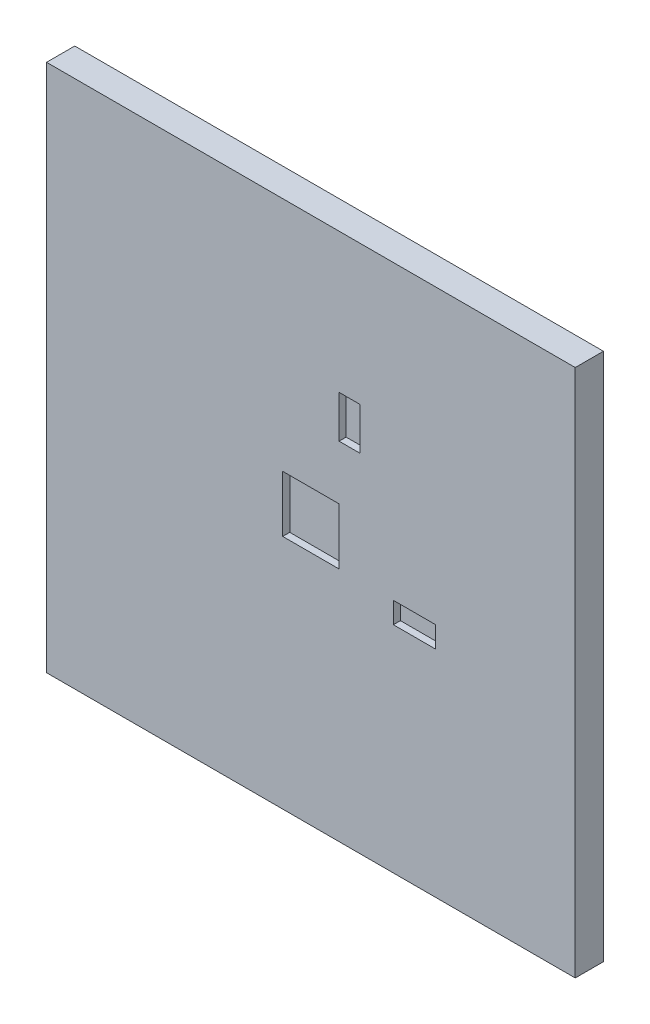
ISO-10303-21;
HEADER;
FILE_DESCRIPTION(('STEP AP214'),'2;1');
FILE_NAME('part.step','',(''),(''),'','','');
FILE_SCHEMA(('AUTOMOTIVE_DESIGN { 1 0 10303 214 1 1 1 1 }'));
ENDSEC;
DATA;
#1=APPLICATION_CONTEXT('core data for automotive mechanical design processes');
#2=APPLICATION_PROTOCOL_DEFINITION('international standard','automotive_design',2000,#1);
#3=PRODUCT_CONTEXT('',#1,'mechanical');
#4=PRODUCT('Part','Part','',(#3));
#5=PRODUCT_RELATED_PRODUCT_CATEGORY('part','',(#4));
#6=PRODUCT_DEFINITION_FORMATION('','',#4);
#7=PRODUCT_DEFINITION_CONTEXT('part definition',#1,'design');
#8=PRODUCT_DEFINITION('design','',#6,#7);
#9=PRODUCT_DEFINITION_SHAPE('','',#8);
#10=(LENGTH_UNIT() NAMED_UNIT(*) SI_UNIT(.MILLI.,.METRE.));
#11=(NAMED_UNIT(*) PLANE_ANGLE_UNIT() SI_UNIT($,.RADIAN.));
#12=(NAMED_UNIT(*) SI_UNIT($,.STERADIAN.) SOLID_ANGLE_UNIT());
#13=UNCERTAINTY_MEASURE_WITH_UNIT(LENGTH_MEASURE(1.E-05),#10,'distance_accuracy_value','');
#14=(GEOMETRIC_REPRESENTATION_CONTEXT(3) GLOBAL_UNCERTAINTY_ASSIGNED_CONTEXT((#13)) GLOBAL_UNIT_ASSIGNED_CONTEXT((#10,
#11,#12)) REPRESENTATION_CONTEXT('',''));
#15=CARTESIAN_POINT('',(0.,0.,0.));
#16=DIRECTION('',(0.,0.,1.));
#17=DIRECTION('',(1.,0.,0.));
#18=AXIS2_PLACEMENT_3D('',#15,#16,#17);
#19=CARTESIAN_POINT('',(0.,0.,20.));
#20=DIRECTION('',(0.,0.,-1.));
#21=DIRECTION('',(-1.,0.,0.));
#22=AXIS2_PLACEMENT_3D('',#19,#20,#21);
#23=PLANE('',#22);
#24=DIRECTION('',(0.,-1.,0.));
#25=VECTOR('',#24,1.);
#26=CARTESIAN_POINT('',(81.3191489361703,0.,20.));
#27=LINE('',#26,#25);
#28=CARTESIAN_POINT('',(81.3191489361703,-115.212765957447,20.));
#29=VERTEX_POINT('',#28);
#30=CARTESIAN_POINT('',(81.3191489361703,-130.212765957447,20.));
#31=VERTEX_POINT('',#30);
#32=EDGE_CURVE('E63',#29,#31,#27,.T.);
#33=ORIENTED_EDGE('',*,*,#32,.T.);
#34=DIRECTION('',(1.,0.,0.));
#35=VECTOR('',#34,1.);
#36=CARTESIAN_POINT('',(0.,-130.212765957447,20.));
#37=LINE('',#36,#35);
#38=CARTESIAN_POINT('',(51.3191489361703,-130.212765957447,20.));
#39=VERTEX_POINT('',#38);
#40=EDGE_CURVE('E218',#39,#31,#37,.T.);
#41=ORIENTED_EDGE('',*,*,#40,.F.);
#42=DIRECTION('',(0.,-1.,0.));
#43=VECTOR('',#42,1.);
#44=CARTESIAN_POINT('',(51.3191489361703,0.,20.));
#45=LINE('',#44,#43);
#46=CARTESIAN_POINT('',(51.3191489361703,-115.212765957447,20.));
#47=VERTEX_POINT('',#46);
#48=EDGE_CURVE('E222',#47,#39,#45,.T.);
#49=ORIENTED_EDGE('',*,*,#48,.F.);
#50=DIRECTION('',(1.,0.,0.));
#51=VECTOR('',#50,1.);
#52=CARTESIAN_POINT('',(0.,-115.212765957447,20.));
#53=LINE('',#52,#51);
#54=EDGE_CURVE('E227',#47,#29,#53,.T.);
#55=ORIENTED_EDGE('',*,*,#54,.T.);
#56=EDGE_LOOP('',(#33,#41,#49,#55));
#57=FACE_BOUND('',#56,.T.);
#58=DIRECTION('',(0.,-1.,0.));
#59=VECTOR('',#58,1.);
#60=CARTESIAN_POINT('',(12.8191489361703,-75.2127659574467,20.));
#61=LINE('',#60,#59);
#62=CARTESIAN_POINT('',(12.8191489361703,-75.2127659574467,20.));
#63=VERTEX_POINT('',#62);
#64=CARTESIAN_POINT('',(12.8191489361703,-115.212765957447,20.));
#65=VERTEX_POINT('',#64);
#66=EDGE_CURVE('E268',#63,#65,#61,.T.);
#67=ORIENTED_EDGE('',*,*,#66,.T.);
#68=DIRECTION('',(1.,0.,0.));
#69=VECTOR('',#68,1.);
#70=CARTESIAN_POINT('',(-27.1808510638297,-115.212765957447,20.));
#71=LINE('',#70,#69);
#72=CARTESIAN_POINT('',(-27.1808510638297,-115.212765957447,20.));
#73=VERTEX_POINT('',#72);
#74=EDGE_CURVE('E217',#73,#65,#71,.T.);
#75=ORIENTED_EDGE('',*,*,#74,.F.);
#76=DIRECTION('',(0.,-1.,0.));
#77=VECTOR('',#76,1.);
#78=CARTESIAN_POINT('',(-27.1808510638297,-75.2127659574467,20.));
#79=LINE('',#78,#77);
#80=CARTESIAN_POINT('',(-27.1808510638297,-75.2127659574467,20.));
#81=VERTEX_POINT('',#80);
#82=EDGE_CURVE('E259',#81,#73,#79,.T.);
#83=ORIENTED_EDGE('',*,*,#82,.F.);
#84=DIRECTION('',(1.,0.,0.));
#85=VECTOR('',#84,1.);
#86=CARTESIAN_POINT('',(-27.1808510638297,-75.2127659574467,20.));
#87=LINE('',#86,#85);
#88=EDGE_CURVE('E263',#81,#63,#87,.T.);
#89=ORIENTED_EDGE('',*,*,#88,.T.);
#90=EDGE_LOOP('',(#67,#75,#83,#89));
#91=FACE_BOUND('',#90,.T.);
#92=DIRECTION('',(1.,0.,0.));
#93=VECTOR('',#92,1.);
#94=CARTESIAN_POINT('',(-194.68085106383,-282.712765957447,20.));
#95=LINE('',#94,#93);
#96=CARTESIAN_POINT('',(-194.68085106383,-282.712765957447,20.));
#97=VERTEX_POINT('',#96);
#98=CARTESIAN_POINT('',(180.31914893617,-282.712765957447,20.));
#99=VERTEX_POINT('',#98);
#100=EDGE_CURVE('E286',#97,#99,#95,.T.);
#101=ORIENTED_EDGE('',*,*,#100,.T.);
#102=DIRECTION('',(0.,-1.,0.));
#103=VECTOR('',#102,1.);
#104=CARTESIAN_POINT('',(180.31914893617,92.2872340425532,20.));
#105=LINE('',#104,#103);
#106=CARTESIAN_POINT('',(180.31914893617,92.2872340425532,20.));
#107=VERTEX_POINT('',#106);
#108=EDGE_CURVE('E289',#107,#99,#105,.T.);
#109=ORIENTED_EDGE('',*,*,#108,.F.);
#110=DIRECTION('',(1.,0.,0.));
#111=VECTOR('',#110,1.);
#112=CARTESIAN_POINT('',(-194.68085106383,92.2872340425532,20.));
#113=LINE('',#112,#111);
#114=CARTESIAN_POINT('',(-194.68085106383,92.2872340425532,20.));
#115=VERTEX_POINT('',#114);
#116=EDGE_CURVE('E294',#115,#107,#113,.T.);
#117=ORIENTED_EDGE('',*,*,#116,.F.);
#118=DIRECTION('',(0.,-1.,0.));
#119=VECTOR('',#118,1.);
#120=CARTESIAN_POINT('',(-194.68085106383,92.2872340425532,20.));
#121=LINE('',#120,#119);
#122=EDGE_CURVE('E298',#115,#97,#121,.T.);
#123=ORIENTED_EDGE('',*,*,#122,.T.);
#124=EDGE_LOOP('',(#101,#109,#117,#123));
#125=FACE_BOUND('',#124,.T.);
#126=DIRECTION('',(0.,-1.,0.));
#127=VECTOR('',#126,1.);
#128=CARTESIAN_POINT('',(27.8191489361703,0.,20.));
#129=LINE('',#128,#127);
#130=CARTESIAN_POINT('',(27.8191489361703,-6.7127659574468,20.));
#131=VERTEX_POINT('',#130);
#132=CARTESIAN_POINT('',(27.8191489361703,-36.7127659574468,20.));
#133=VERTEX_POINT('',#132);
#134=EDGE_CURVE('E55',#131,#133,#129,.T.);
#135=ORIENTED_EDGE('',*,*,#134,.T.);
#136=DIRECTION('',(1.,0.,0.));
#137=VECTOR('',#136,1.);
#138=CARTESIAN_POINT('',(0.,-36.7127659574468,20.));
#139=LINE('',#138,#137);
#140=CARTESIAN_POINT('',(12.8191489361703,-36.7127659574468,20.));
#141=VERTEX_POINT('',#140);
#142=EDGE_CURVE('E176',#141,#133,#139,.T.);
#143=ORIENTED_EDGE('',*,*,#142,.F.);
#144=DIRECTION('',(0.,-1.,0.));
#145=VECTOR('',#144,1.);
#146=CARTESIAN_POINT('',(12.8191489361703,0.,20.));
#147=LINE('',#146,#145);
#148=CARTESIAN_POINT('',(12.8191489361703,-6.7127659574468,20.));
#149=VERTEX_POINT('',#148);
#150=EDGE_CURVE('E180',#149,#141,#147,.T.);
#151=ORIENTED_EDGE('',*,*,#150,.F.);
#152=DIRECTION('',(1.,0.,0.));
#153=VECTOR('',#152,1.);
#154=CARTESIAN_POINT('',(0.,-6.7127659574468,20.));
#155=LINE('',#154,#153);
#156=EDGE_CURVE('E189',#149,#131,#155,.T.);
#157=ORIENTED_EDGE('',*,*,#156,.T.);
#158=EDGE_LOOP('',(#135,#143,#151,#157));
#159=FACE_BOUND('',#158,.T.);
#160=ADVANCED_FACE('F39',(#57,#91,#125,#159),#23,.F.);
#161=CARTESIAN_POINT('',(-194.68085106383,-282.712765957447,20.));
#162=DIRECTION('',(0.,1.,0.));
#163=DIRECTION('',(0.,0.,1.));
#164=AXIS2_PLACEMENT_3D('',#161,#162,#163);
#165=PLANE('',#164);
#166=DIRECTION('',(1.,0.,0.));
#167=VECTOR('',#166,1.);
#168=CARTESIAN_POINT('',(-194.68085106383,-282.712765957447,0.));
#169=LINE('',#168,#167);
#170=CARTESIAN_POINT('',(-194.68085106383,-282.712765957447,0.));
#171=VERTEX_POINT('',#170);
#172=CARTESIAN_POINT('',(180.31914893617,-282.712765957447,0.));
#173=VERTEX_POINT('',#172);
#174=EDGE_CURVE('E198',#171,#173,#169,.T.);
#175=ORIENTED_EDGE('',*,*,#174,.T.);
#176=DIRECTION('',(0.,0.,-1.));
#177=VECTOR('',#176,1.);
#178=CARTESIAN_POINT('',(180.31914893617,-282.712765957447,20.));
#179=LINE('',#178,#177);
#180=EDGE_CURVE('E11',#99,#173,#179,.T.);
#181=ORIENTED_EDGE('',*,*,#180,.F.);
#182=ORIENTED_EDGE('',*,*,#100,.F.);
#183=DIRECTION('',(0.,0.,-1.));
#184=VECTOR('',#183,1.);
#185=CARTESIAN_POINT('',(-194.68085106383,-282.712765957447,20.));
#186=LINE('',#185,#184);
#187=EDGE_CURVE('E301',#97,#171,#186,.T.);
#188=ORIENTED_EDGE('',*,*,#187,.T.);
#189=EDGE_LOOP('',(#175,#181,#182,#188));
#190=FACE_BOUND('',#189,.T.);
#191=ADVANCED_FACE('F41',(#190),#165,.F.);
#192=CARTESIAN_POINT('',(180.31914893617,92.2872340425532,20.));
#193=DIRECTION('',(1.,0.,0.));
#194=DIRECTION('',(0.,1.,0.));
#195=AXIS2_PLACEMENT_3D('',#192,#193,#194);
#196=PLANE('',#195);
#197=DIRECTION('',(0.,-1.,0.));
#198=VECTOR('',#197,1.);
#199=CARTESIAN_POINT('',(180.31914893617,92.2872340425532,0.));
#200=LINE('',#199,#198);
#201=CARTESIAN_POINT('',(180.31914893617,92.2872340425532,0.));
#202=VERTEX_POINT('',#201);
#203=EDGE_CURVE('E305',#202,#173,#200,.T.);
#204=ORIENTED_EDGE('',*,*,#203,.F.);
#205=DIRECTION('',(0.,0.,-1.));
#206=VECTOR('',#205,1.);
#207=CARTESIAN_POINT('',(180.31914893617,92.2872340425532,20.));
#208=LINE('',#207,#206);
#209=EDGE_CURVE('E48',#107,#202,#208,.T.);
#210=ORIENTED_EDGE('',*,*,#209,.F.);
#211=ORIENTED_EDGE('',*,*,#108,.T.);
#212=ORIENTED_EDGE('',*,*,#180,.T.);
#213=EDGE_LOOP('',(#204,#210,#211,#212));
#214=FACE_BOUND('',#213,.T.);
#215=ADVANCED_FACE('F328',(#214),#196,.T.);
#216=CARTESIAN_POINT('',(-194.68085106383,92.2872340425532,20.));
#217=DIRECTION('',(0.,1.,0.));
#218=DIRECTION('',(0.,0.,1.));
#219=AXIS2_PLACEMENT_3D('',#216,#217,#218);
#220=PLANE('',#219);
#221=DIRECTION('',(1.,0.,0.));
#222=VECTOR('',#221,1.);
#223=CARTESIAN_POINT('',(-194.68085106383,92.2872340425532,0.));
#224=LINE('',#223,#222);
#225=CARTESIAN_POINT('',(-194.68085106383,92.2872340425532,0.));
#226=VERTEX_POINT('',#225);
#227=EDGE_CURVE('E309',#226,#202,#224,.T.);
#228=ORIENTED_EDGE('',*,*,#227,.F.);
#229=DIRECTION('',(0.,0.,-1.));
#230=VECTOR('',#229,1.);
#231=CARTESIAN_POINT('',(-194.68085106383,92.2872340425532,20.));
#232=LINE('',#231,#230);
#233=EDGE_CURVE('E318',#115,#226,#232,.T.);
#234=ORIENTED_EDGE('',*,*,#233,.F.);
#235=ORIENTED_EDGE('',*,*,#116,.T.);
#236=ORIENTED_EDGE('',*,*,#209,.T.);
#237=EDGE_LOOP('',(#228,#234,#235,#236));
#238=FACE_BOUND('',#237,.T.);
#239=ADVANCED_FACE('F324',(#238),#220,.T.);
#240=CARTESIAN_POINT('',(-194.68085106383,92.2872340425532,20.));
#241=DIRECTION('',(1.,0.,0.));
#242=DIRECTION('',(0.,1.,0.));
#243=AXIS2_PLACEMENT_3D('',#240,#241,#242);
#244=PLANE('',#243);
#245=DIRECTION('',(0.,-1.,0.));
#246=VECTOR('',#245,1.);
#247=CARTESIAN_POINT('',(-194.68085106383,92.2872340425532,0.));
#248=LINE('',#247,#246);
#249=EDGE_CURVE('E290',#226,#171,#248,.T.);
#250=ORIENTED_EDGE('',*,*,#249,.T.);
#251=ORIENTED_EDGE('',*,*,#187,.F.);
#252=ORIENTED_EDGE('',*,*,#122,.F.);
#253=ORIENTED_EDGE('',*,*,#233,.T.);
#254=EDGE_LOOP('',(#250,#251,#252,#253));
#255=FACE_BOUND('',#254,.T.);
#256=ADVANCED_FACE('F336',(#255),#244,.F.);
#257=CARTESIAN_POINT('',(0.,0.,0.));
#258=DIRECTION('',(0.,0.,-1.));
#259=DIRECTION('',(-1.,0.,0.));
#260=AXIS2_PLACEMENT_3D('',#257,#258,#259);
#261=PLANE('',#260);
#262=ORIENTED_EDGE('',*,*,#174,.F.);
#263=ORIENTED_EDGE('',*,*,#249,.F.);
#264=ORIENTED_EDGE('',*,*,#227,.T.);
#265=ORIENTED_EDGE('',*,*,#203,.T.);
#266=EDGE_LOOP('',(#262,#263,#264,#265));
#267=FACE_BOUND('',#266,.T.);
#268=ADVANCED_FACE('F333',(#267),#261,.T.);
#269=CARTESIAN_POINT('',(-27.1808510638297,-115.212765957447,15.));
#270=DIRECTION('',(0.,-1.,0.));
#271=DIRECTION('',(0.,0.,-1.));
#272=AXIS2_PLACEMENT_3D('',#269,#270,#271);
#273=PLANE('',#272);
#274=ORIENTED_EDGE('',*,*,#74,.T.);
#275=DIRECTION('',(0.,0.,1.));
#276=VECTOR('',#275,1.);
#277=CARTESIAN_POINT('',(12.8191489361703,-115.212765957447,15.));
#278=LINE('',#277,#276);
#279=CARTESIAN_POINT('',(12.8191489361703,-115.212765957447,15.));
#280=VERTEX_POINT('',#279);
#281=EDGE_CURVE('E245',#280,#65,#278,.T.);
#282=ORIENTED_EDGE('',*,*,#281,.F.);
#283=DIRECTION('',(1.,0.,0.));
#284=VECTOR('',#283,1.);
#285=CARTESIAN_POINT('',(-27.1808510638297,-115.212765957447,15.));
#286=LINE('',#285,#284);
#287=CARTESIAN_POINT('',(-27.1808510638297,-115.212765957447,15.));
#288=VERTEX_POINT('',#287);
#289=EDGE_CURVE('E264',#288,#280,#286,.T.);
#290=ORIENTED_EDGE('',*,*,#289,.F.);
#291=DIRECTION('',(0.,0.,1.));
#292=VECTOR('',#291,1.);
#293=CARTESIAN_POINT('',(-27.1808510638297,-115.212765957447,15.));
#294=LINE('',#293,#292);
#295=EDGE_CURVE('E256',#288,#73,#294,.T.);
#296=ORIENTED_EDGE('',*,*,#295,.T.);
#297=EDGE_LOOP('',(#274,#282,#290,#296));
#298=FACE_BOUND('',#297,.T.);
#299=ADVANCED_FACE('F383',(#298),#273,.F.);
#300=CARTESIAN_POINT('',(-27.1808510638297,-75.2127659574467,15.));
#301=DIRECTION('',(-1.,0.,0.));
#302=DIRECTION('',(0.,0.,1.));
#303=AXIS2_PLACEMENT_3D('',#300,#301,#302);
#304=PLANE('',#303);
#305=ORIENTED_EDGE('',*,*,#82,.T.);
#306=ORIENTED_EDGE('',*,*,#295,.F.);
#307=DIRECTION('',(0.,-1.,0.));
#308=VECTOR('',#307,1.);
#309=CARTESIAN_POINT('',(-27.1808510638297,-75.2127659574467,15.));
#310=LINE('',#309,#308);
#311=CARTESIAN_POINT('',(-27.1808510638297,-75.2127659574467,15.));
#312=VERTEX_POINT('',#311);
#313=EDGE_CURVE('E249',#312,#288,#310,.T.);
#314=ORIENTED_EDGE('',*,*,#313,.F.);
#315=DIRECTION('',(0.,0.,1.));
#316=VECTOR('',#315,1.);
#317=CARTESIAN_POINT('',(-27.1808510638297,-75.2127659574467,15.));
#318=LINE('',#317,#316);
#319=EDGE_CURVE('E253',#312,#81,#318,.T.);
#320=ORIENTED_EDGE('',*,*,#319,.T.);
#321=EDGE_LOOP('',(#305,#306,#314,#320));
#322=FACE_BOUND('',#321,.T.);
#323=ADVANCED_FACE('F386',(#322),#304,.F.);
#324=CARTESIAN_POINT('',(-27.1808510638297,-75.2127659574467,15.));
#325=DIRECTION('',(0.,-1.,0.));
#326=DIRECTION('',(0.,0.,-1.));
#327=AXIS2_PLACEMENT_3D('',#324,#325,#326);
#328=PLANE('',#327);
#329=ORIENTED_EDGE('',*,*,#88,.F.);
#330=ORIENTED_EDGE('',*,*,#319,.F.);
#331=DIRECTION('',(1.,0.,0.));
#332=VECTOR('',#331,1.);
#333=CARTESIAN_POINT('',(-27.1808510638297,-75.2127659574467,15.));
#334=LINE('',#333,#332);
#335=CARTESIAN_POINT('',(12.8191489361703,-75.2127659574467,15.));
#336=VERTEX_POINT('',#335);
#337=EDGE_CURVE('E277',#312,#336,#334,.T.);
#338=ORIENTED_EDGE('',*,*,#337,.T.);
#339=DIRECTION('',(0.,0.,1.));
#340=VECTOR('',#339,1.);
#341=CARTESIAN_POINT('',(12.8191489361703,-75.2127659574467,15.));
#342=LINE('',#341,#340);
#343=EDGE_CURVE('E250',#336,#63,#342,.T.);
#344=ORIENTED_EDGE('',*,*,#343,.T.);
#345=EDGE_LOOP('',(#329,#330,#338,#344));
#346=FACE_BOUND('',#345,.T.);
#347=ADVANCED_FACE('F391',(#346),#328,.T.);
#348=CARTESIAN_POINT('',(12.8191489361703,-75.2127659574467,15.));
#349=DIRECTION('',(-1.,0.,0.));
#350=DIRECTION('',(0.,-1.,0.));
#351=AXIS2_PLACEMENT_3D('',#348,#349,#350);
#352=PLANE('',#351);
#353=ORIENTED_EDGE('',*,*,#66,.F.);
#354=ORIENTED_EDGE('',*,*,#343,.F.);
#355=DIRECTION('',(0.,-1.,0.));
#356=VECTOR('',#355,1.);
#357=CARTESIAN_POINT('',(12.8191489361703,-75.2127659574467,15.));
#358=LINE('',#357,#356);
#359=EDGE_CURVE('E280',#336,#280,#358,.T.);
#360=ORIENTED_EDGE('',*,*,#359,.T.);
#361=ORIENTED_EDGE('',*,*,#281,.T.);
#362=EDGE_LOOP('',(#353,#354,#360,#361));
#363=FACE_BOUND('',#362,.T.);
#364=ADVANCED_FACE('F388',(#363),#352,.T.);
#365=CARTESIAN_POINT('',(0.,0.,15.));
#366=DIRECTION('',(0.,0.,-1.));
#367=DIRECTION('',(-1.,0.,0.));
#368=AXIS2_PLACEMENT_3D('',#365,#366,#367);
#369=PLANE('',#368);
#370=ORIENTED_EDGE('',*,*,#289,.T.);
#371=ORIENTED_EDGE('',*,*,#359,.F.);
#372=ORIENTED_EDGE('',*,*,#337,.F.);
#373=ORIENTED_EDGE('',*,*,#313,.T.);
#374=EDGE_LOOP('',(#370,#371,#372,#373));
#375=FACE_BOUND('',#374,.T.);
#376=ADVANCED_FACE('F368',(#375),#369,.F.);
#377=CARTESIAN_POINT('',(81.3191489361703,0.,15.));
#378=DIRECTION('',(-1.,0.,0.));
#379=DIRECTION('',(0.,0.,1.));
#380=AXIS2_PLACEMENT_3D('',#377,#378,#379);
#381=PLANE('',#380);
#382=ORIENTED_EDGE('',*,*,#32,.F.);
#383=DIRECTION('',(0.,0.,1.));
#384=VECTOR('',#383,1.);
#385=CARTESIAN_POINT('',(81.3191489361703,-115.212765957447,15.));
#386=LINE('',#385,#384);
#387=CARTESIAN_POINT('',(81.3191489361703,-115.212765957447,15.));
#388=VERTEX_POINT('',#387);
#389=EDGE_CURVE('E204',#388,#29,#386,.T.);
#390=ORIENTED_EDGE('',*,*,#389,.F.);
#391=DIRECTION('',(0.,-1.,0.));
#392=VECTOR('',#391,1.);
#393=CARTESIAN_POINT('',(81.3191489361703,0.,15.));
#394=LINE('',#393,#392);
#395=CARTESIAN_POINT('',(81.3191489361703,-130.212765957447,15.));
#396=VERTEX_POINT('',#395);
#397=EDGE_CURVE('E223',#388,#396,#394,.T.);
#398=ORIENTED_EDGE('',*,*,#397,.T.);
#399=DIRECTION('',(0.,0.,1.));
#400=VECTOR('',#399,1.);
#401=CARTESIAN_POINT('',(81.3191489361703,-130.212765957447,15.));
#402=LINE('',#401,#400);
#403=EDGE_CURVE('E214',#396,#31,#402,.T.);
#404=ORIENTED_EDGE('',*,*,#403,.T.);
#405=EDGE_LOOP('',(#382,#390,#398,#404));
#406=FACE_BOUND('',#405,.T.);
#407=ADVANCED_FACE('F364',(#406),#381,.T.);
#408=CARTESIAN_POINT('',(0.,-130.212765957447,15.));
#409=DIRECTION('',(0.,-1.,0.));
#410=DIRECTION('',(0.,0.,-1.));
#411=AXIS2_PLACEMENT_3D('',#408,#409,#410);
#412=PLANE('',#411);
#413=ORIENTED_EDGE('',*,*,#40,.T.);
#414=ORIENTED_EDGE('',*,*,#403,.F.);
#415=DIRECTION('',(1.,0.,0.));
#416=VECTOR('',#415,1.);
#417=CARTESIAN_POINT('',(0.,-130.212765957447,15.));
#418=LINE('',#417,#416);
#419=CARTESIAN_POINT('',(51.3191489361703,-130.212765957447,15.));
#420=VERTEX_POINT('',#419);
#421=EDGE_CURVE('E207',#420,#396,#418,.T.);
#422=ORIENTED_EDGE('',*,*,#421,.F.);
#423=DIRECTION('',(0.,0.,1.));
#424=VECTOR('',#423,1.);
#425=CARTESIAN_POINT('',(51.3191489361703,-130.212765957447,15.));
#426=LINE('',#425,#424);
#427=EDGE_CURVE('E211',#420,#39,#426,.T.);
#428=ORIENTED_EDGE('',*,*,#427,.T.);
#429=EDGE_LOOP('',(#413,#414,#422,#428));
#430=FACE_BOUND('',#429,.T.);
#431=ADVANCED_FACE('F367',(#430),#412,.F.);
#432=CARTESIAN_POINT('',(51.3191489361703,0.,15.));
#433=DIRECTION('',(-1.,0.,0.));
#434=DIRECTION('',(0.,0.,1.));
#435=AXIS2_PLACEMENT_3D('',#432,#433,#434);
#436=PLANE('',#435);
#437=ORIENTED_EDGE('',*,*,#48,.T.);
#438=ORIENTED_EDGE('',*,*,#427,.F.);
#439=DIRECTION('',(0.,-1.,0.));
#440=VECTOR('',#439,1.);
#441=CARTESIAN_POINT('',(51.3191489361703,0.,15.));
#442=LINE('',#441,#440);
#443=CARTESIAN_POINT('',(51.3191489361703,-115.212765957447,15.));
#444=VERTEX_POINT('',#443);
#445=EDGE_CURVE('E236',#444,#420,#442,.T.);
#446=ORIENTED_EDGE('',*,*,#445,.F.);
#447=DIRECTION('',(0.,0.,1.));
#448=VECTOR('',#447,1.);
#449=CARTESIAN_POINT('',(51.3191489361703,-115.212765957447,15.));
#450=LINE('',#449,#448);
#451=EDGE_CURVE('E208',#444,#47,#450,.T.);
#452=ORIENTED_EDGE('',*,*,#451,.T.);
#453=EDGE_LOOP('',(#437,#438,#446,#452));
#454=FACE_BOUND('',#453,.T.);
#455=ADVANCED_FACE('F372',(#454),#436,.F.);
#456=CARTESIAN_POINT('',(0.,-115.212765957447,15.));
#457=DIRECTION('',(0.,-1.,0.));
#458=DIRECTION('',(0.,0.,-1.));
#459=AXIS2_PLACEMENT_3D('',#456,#457,#458);
#460=PLANE('',#459);
#461=ORIENTED_EDGE('',*,*,#54,.F.);
#462=ORIENTED_EDGE('',*,*,#451,.F.);
#463=DIRECTION('',(1.,0.,0.));
#464=VECTOR('',#463,1.);
#465=CARTESIAN_POINT('',(0.,-115.212765957447,15.));
#466=LINE('',#465,#464);
#467=EDGE_CURVE('E240',#444,#388,#466,.T.);
#468=ORIENTED_EDGE('',*,*,#467,.T.);
#469=ORIENTED_EDGE('',*,*,#389,.T.);
#470=EDGE_LOOP('',(#461,#462,#468,#469));
#471=FACE_BOUND('',#470,.T.);
#472=ADVANCED_FACE('F369',(#471),#460,.T.);
#473=CARTESIAN_POINT('',(0.,0.,15.));
#474=DIRECTION('',(0.,0.,1.));
#475=DIRECTION('',(1.,0.,0.));
#476=AXIS2_PLACEMENT_3D('',#473,#474,#475);
#477=PLANE('',#476);
#478=ORIENTED_EDGE('',*,*,#397,.F.);
#479=ORIENTED_EDGE('',*,*,#467,.F.);
#480=ORIENTED_EDGE('',*,*,#445,.T.);
#481=ORIENTED_EDGE('',*,*,#421,.T.);
#482=EDGE_LOOP('',(#478,#479,#480,#481));
#483=FACE_BOUND('',#482,.T.);
#484=ADVANCED_FACE('F358',(#483),#477,.T.);
#485=CARTESIAN_POINT('',(27.8191489361703,0.,15.));
#486=DIRECTION('',(-1.,0.,0.));
#487=DIRECTION('',(0.,-1.,0.));
#488=AXIS2_PLACEMENT_3D('',#485,#486,#487);
#489=PLANE('',#488);
#490=ORIENTED_EDGE('',*,*,#134,.F.);
#491=DIRECTION('',(0.,0.,1.));
#492=VECTOR('',#491,1.);
#493=CARTESIAN_POINT('',(27.8191489361703,-6.7127659574468,15.));
#494=LINE('',#493,#492);
#495=CARTESIAN_POINT('',(27.8191489361703,-6.7127659574468,15.));
#496=VERTEX_POINT('',#495);
#497=EDGE_CURVE('E156',#496,#131,#494,.T.);
#498=ORIENTED_EDGE('',*,*,#497,.F.);
#499=DIRECTION('',(0.,-1.,0.));
#500=VECTOR('',#499,1.);
#501=CARTESIAN_POINT('',(27.8191489361703,0.,15.));
#502=LINE('',#501,#500);
#503=CARTESIAN_POINT('',(27.8191489361703,-36.7127659574468,15.));
#504=VERTEX_POINT('',#503);
#505=EDGE_CURVE('E165',#496,#504,#502,.T.);
#506=ORIENTED_EDGE('',*,*,#505,.T.);
#507=DIRECTION('',(0.,0.,1.));
#508=VECTOR('',#507,1.);
#509=CARTESIAN_POINT('',(27.8191489361703,-36.7127659574468,15.));
#510=LINE('',#509,#508);
#511=EDGE_CURVE('E195',#504,#133,#510,.T.);
#512=ORIENTED_EDGE('',*,*,#511,.T.);
#513=EDGE_LOOP('',(#490,#498,#506,#512));
#514=FACE_BOUND('',#513,.T.);
#515=ADVANCED_FACE('F167',(#514),#489,.T.);
#516=CARTESIAN_POINT('',(0.,-36.7127659574468,15.));
#517=DIRECTION('',(0.,-1.,0.));
#518=DIRECTION('',(0.,0.,-1.));
#519=AXIS2_PLACEMENT_3D('',#516,#517,#518);
#520=PLANE('',#519);
#521=ORIENTED_EDGE('',*,*,#142,.T.);
#522=ORIENTED_EDGE('',*,*,#511,.F.);
#523=DIRECTION('',(1.,0.,0.));
#524=VECTOR('',#523,1.);
#525=CARTESIAN_POINT('',(0.,-36.7127659574468,15.));
#526=LINE('',#525,#524);
#527=CARTESIAN_POINT('',(12.8191489361703,-36.7127659574468,15.));
#528=VERTEX_POINT('',#527);
#529=EDGE_CURVE('E170',#528,#504,#526,.T.);
#530=ORIENTED_EDGE('',*,*,#529,.F.);
#531=DIRECTION('',(0.,0.,1.));
#532=VECTOR('',#531,1.);
#533=CARTESIAN_POINT('',(12.8191489361703,-36.7127659574468,15.));
#534=LINE('',#533,#532);
#535=EDGE_CURVE('E199',#528,#141,#534,.T.);
#536=ORIENTED_EDGE('',*,*,#535,.T.);
#537=EDGE_LOOP('',(#521,#522,#530,#536));
#538=FACE_BOUND('',#537,.T.);
#539=ADVANCED_FACE('F350',(#538),#520,.F.);
#540=CARTESIAN_POINT('',(12.8191489361703,0.,15.));
#541=DIRECTION('',(-1.,0.,0.));
#542=DIRECTION('',(0.,-1.,0.));
#543=AXIS2_PLACEMENT_3D('',#540,#541,#542);
#544=PLANE('',#543);
#545=ORIENTED_EDGE('',*,*,#150,.T.);
#546=ORIENTED_EDGE('',*,*,#535,.F.);
#547=DIRECTION('',(0.,-1.,0.));
#548=VECTOR('',#547,1.);
#549=CARTESIAN_POINT('',(12.8191489361703,0.,15.));
#550=LINE('',#549,#548);
#551=CARTESIAN_POINT('',(12.8191489361703,-6.7127659574468,15.));
#552=VERTEX_POINT('',#551);
#553=EDGE_CURVE('E164',#552,#528,#550,.T.);
#554=ORIENTED_EDGE('',*,*,#553,.F.);
#555=DIRECTION('',(0.,0.,1.));
#556=VECTOR('',#555,1.);
#557=CARTESIAN_POINT('',(12.8191489361703,-6.7127659574468,15.));
#558=LINE('',#557,#556);
#559=EDGE_CURVE('E158',#552,#149,#558,.T.);
#560=ORIENTED_EDGE('',*,*,#559,.T.);
#561=EDGE_LOOP('',(#545,#546,#554,#560));
#562=FACE_BOUND('',#561,.T.);
#563=ADVANCED_FACE('F348',(#562),#544,.F.);
#564=CARTESIAN_POINT('',(0.,-6.7127659574468,15.));
#565=DIRECTION('',(0.,-1.,0.));
#566=DIRECTION('',(0.,0.,-1.));
#567=AXIS2_PLACEMENT_3D('',#564,#565,#566);
#568=PLANE('',#567);
#569=ORIENTED_EDGE('',*,*,#156,.F.);
#570=ORIENTED_EDGE('',*,*,#559,.F.);
#571=DIRECTION('',(1.,0.,0.));
#572=VECTOR('',#571,1.);
#573=CARTESIAN_POINT('',(0.,-6.7127659574468,15.));
#574=LINE('',#573,#572);
#575=EDGE_CURVE('E153',#552,#496,#574,.T.);
#576=ORIENTED_EDGE('',*,*,#575,.T.);
#577=ORIENTED_EDGE('',*,*,#497,.T.);
#578=EDGE_LOOP('',(#569,#570,#576,#577));
#579=FACE_BOUND('',#578,.T.);
#580=ADVANCED_FACE('F155',(#579),#568,.T.);
#581=CARTESIAN_POINT('',(0.,0.,15.));
#582=DIRECTION('',(0.,0.,1.));
#583=DIRECTION('',(1.,0.,0.));
#584=AXIS2_PLACEMENT_3D('',#581,#582,#583);
#585=PLANE('',#584);
#586=ORIENTED_EDGE('',*,*,#505,.F.);
#587=ORIENTED_EDGE('',*,*,#575,.F.);
#588=ORIENTED_EDGE('',*,*,#553,.T.);
#589=ORIENTED_EDGE('',*,*,#529,.T.);
#590=EDGE_LOOP('',(#586,#587,#588,#589));
#591=FACE_BOUND('',#590,.T.);
#592=ADVANCED_FACE('F173',(#591),#585,.T.);
#593=CLOSED_SHELL('',(#160,#191,#215,#239,#256,#268,#299,#323,#347,#364,#376,#407,#431,#455,
#472,#484,#515,#539,#563,#580,#592));
#594=MANIFOLD_SOLID_BREP('B2',#593);
#595=ADVANCED_BREP_SHAPE_REPRESENTATION('',(#18,#594),#14);
#596=SHAPE_DEFINITION_REPRESENTATION(#9,#595);
ENDSEC;
END-ISO-10303-21;
